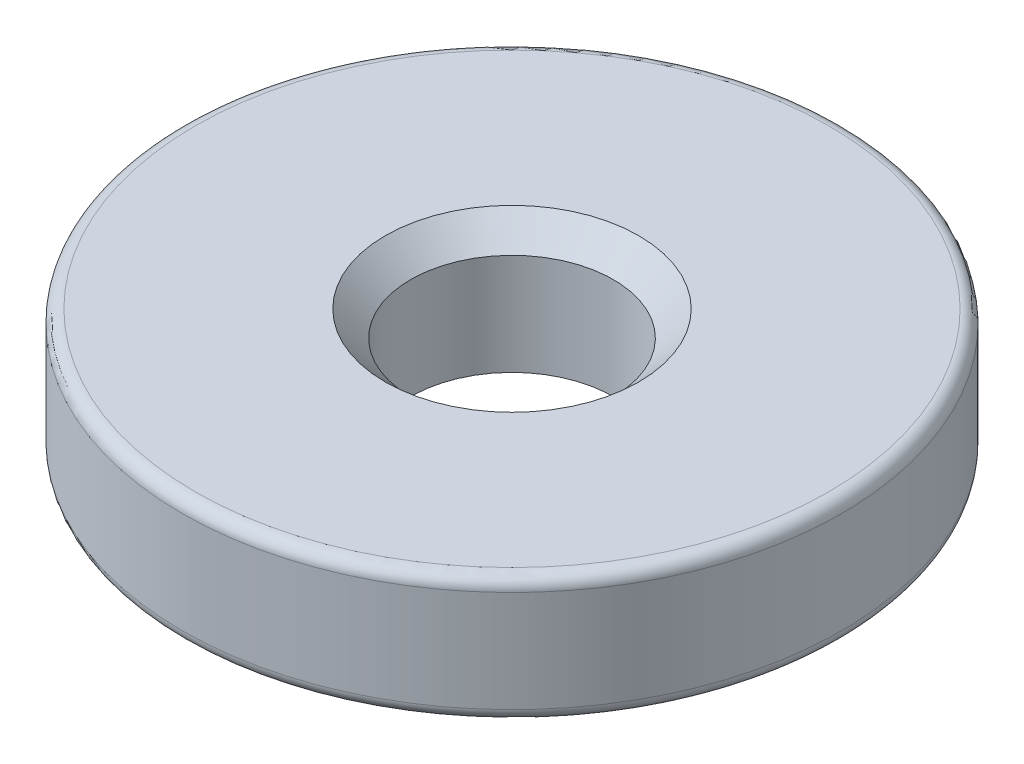
ISO-10303-21;
HEADER;
FILE_DESCRIPTION(('STEP AP214'),'2;1');
FILE_NAME('part.step','',(''),(''),'','','');
FILE_SCHEMA(('AUTOMOTIVE_DESIGN { 1 0 10303 214 1 1 1 1 }'));
ENDSEC;
DATA;
#1=APPLICATION_CONTEXT('core data for automotive mechanical design processes');
#2=APPLICATION_PROTOCOL_DEFINITION('international standard','automotive_design',2000,#1);
#3=PRODUCT_CONTEXT('',#1,'mechanical');
#4=PRODUCT('Part','Part','',(#3));
#5=PRODUCT_RELATED_PRODUCT_CATEGORY('part','',(#4));
#6=PRODUCT_DEFINITION_FORMATION('','',#4);
#7=PRODUCT_DEFINITION_CONTEXT('part definition',#1,'design');
#8=PRODUCT_DEFINITION('design','',#6,#7);
#9=PRODUCT_DEFINITION_SHAPE('','',#8);
#10=(LENGTH_UNIT() NAMED_UNIT(*) SI_UNIT(.MILLI.,.METRE.));
#11=(NAMED_UNIT(*) PLANE_ANGLE_UNIT() SI_UNIT($,.RADIAN.));
#12=(NAMED_UNIT(*) SI_UNIT($,.STERADIAN.) SOLID_ANGLE_UNIT());
#13=UNCERTAINTY_MEASURE_WITH_UNIT(LENGTH_MEASURE(1.E-05),#10,'distance_accuracy_value','');
#14=(GEOMETRIC_REPRESENTATION_CONTEXT(3) GLOBAL_UNCERTAINTY_ASSIGNED_CONTEXT((#13)) GLOBAL_UNIT_ASSIGNED_CONTEXT((#10,
#11,#12)) REPRESENTATION_CONTEXT('',''));
#15=CARTESIAN_POINT('',(0.,0.,0.));
#16=DIRECTION('',(0.,0.,1.));
#17=DIRECTION('',(1.,0.,0.));
#18=AXIS2_PLACEMENT_3D('',#15,#16,#17);
#19=CARTESIAN_POINT('',(0.,5.,0.));
#20=DIRECTION('',(0.,1.,0.));
#21=DIRECTION('',(0.,0.,1.));
#22=AXIS2_PLACEMENT_3D('',#19,#20,#21);
#23=PLANE('',#22);
#24=CARTESIAN_POINT('',(0.,5.,0.));
#25=DIRECTION('',(0.,1.,0.));
#26=DIRECTION('',(0.,0.,1.));
#27=AXIS2_PLACEMENT_3D('',#24,#25,#26);
#28=CIRCLE('',#27,12.5);
#29=CARTESIAN_POINT('',(0.,5.,12.5));
#30=VERTEX_POINT('',#29);
#31=EDGE_CURVE('E10',#30,#30,#28,.T.);
#32=ORIENTED_EDGE('',*,*,#31,.T.);
#33=EDGE_LOOP('',(#32));
#34=FACE_BOUND('',#33,.T.);
#35=CARTESIAN_POINT('',(0.,5.,0.));
#36=DIRECTION('',(0.,1.,0.));
#37=DIRECTION('',(0.,0.,1.));
#38=AXIS2_PLACEMENT_3D('',#35,#36,#37);
#39=CIRCLE('',#38,5.);
#40=CARTESIAN_POINT('',(0.,5.,5.));
#41=VERTEX_POINT('',#40);
#42=EDGE_CURVE('E63',#41,#41,#39,.F.);
#43=ORIENTED_EDGE('',*,*,#42,.T.);
#44=EDGE_LOOP('',(#43));
#45=FACE_BOUND('',#44,.T.);
#46=ADVANCED_FACE('F39',(#34,#45),#23,.T.);
#47=CARTESIAN_POINT('',(0.,0.,0.));
#48=DIRECTION('',(0.,1.,0.));
#49=DIRECTION('',(0.,0.,1.));
#50=AXIS2_PLACEMENT_3D('',#47,#48,#49);
#51=PLANE('',#50);
#52=CARTESIAN_POINT('',(0.,0.,0.));
#53=DIRECTION('',(0.,1.,0.));
#54=DIRECTION('',(0.,0.,1.));
#55=AXIS2_PLACEMENT_3D('',#52,#53,#54);
#56=CIRCLE('',#55,12.5);
#57=CARTESIAN_POINT('',(0.,0.,12.5));
#58=VERTEX_POINT('',#57);
#59=EDGE_CURVE('E47',#58,#58,#56,.F.);
#60=ORIENTED_EDGE('',*,*,#59,.T.);
#61=EDGE_LOOP('',(#60));
#62=FACE_BOUND('',#61,.T.);
#63=CARTESIAN_POINT('',(0.,0.,0.));
#64=DIRECTION('',(0.,1.,0.));
#65=DIRECTION('',(0.,0.,1.));
#66=AXIS2_PLACEMENT_3D('',#63,#64,#65);
#67=CIRCLE('',#66,4.);
#68=CARTESIAN_POINT('',(0.,0.,4.));
#69=VERTEX_POINT('',#68);
#70=EDGE_CURVE('E71',#69,#69,#67,.T.);
#71=ORIENTED_EDGE('',*,*,#70,.T.);
#72=EDGE_LOOP('',(#71));
#73=FACE_BOUND('',#72,.T.);
#74=ADVANCED_FACE('F76',(#62,#73),#51,.F.);
#75=CARTESIAN_POINT('',(0.,5.,0.));
#76=DIRECTION('',(0.,-1.,0.));
#77=DIRECTION('',(0.,0.,-1.));
#78=AXIS2_PLACEMENT_3D('',#75,#76,#77);
#79=CYLINDRICAL_SURFACE('',#78,13.);
#80=CARTESIAN_POINT('',(0.,0.5,0.));
#81=DIRECTION('',(0.,1.,0.));
#82=DIRECTION('',(0.,0.,1.));
#83=AXIS2_PLACEMENT_3D('',#80,#81,#82);
#84=CIRCLE('',#83,13.);
#85=CARTESIAN_POINT('',(0.,0.5,13.));
#86=VERTEX_POINT('',#85);
#87=EDGE_CURVE('E52',#86,#86,#84,.T.);
#88=ORIENTED_EDGE('',*,*,#87,.T.);
#89=EDGE_LOOP('',(#88));
#90=FACE_BOUND('',#89,.T.);
#91=CARTESIAN_POINT('',(0.,4.5,0.));
#92=DIRECTION('',(0.,1.,0.));
#93=DIRECTION('',(0.,0.,1.));
#94=AXIS2_PLACEMENT_3D('',#91,#92,#93);
#95=CIRCLE('',#94,13.);
#96=CARTESIAN_POINT('',(0.,4.5,13.));
#97=VERTEX_POINT('',#96);
#98=EDGE_CURVE('E57',#97,#97,#95,.F.);
#99=ORIENTED_EDGE('',*,*,#98,.T.);
#100=EDGE_LOOP('',(#99));
#101=FACE_BOUND('',#100,.T.);
#102=ADVANCED_FACE('F81',(#90,#101),#79,.T.);
#103=CARTESIAN_POINT('',(0.,5.,0.));
#104=DIRECTION('',(0.,-1.,0.));
#105=DIRECTION('',(0.,0.,-1.));
#106=AXIS2_PLACEMENT_3D('',#103,#104,#105);
#107=CYLINDRICAL_SURFACE('',#106,4.);
#108=CARTESIAN_POINT('',(0.,4.,0.));
#109=DIRECTION('',(0.,1.,0.));
#110=DIRECTION('',(0.,0.,1.));
#111=AXIS2_PLACEMENT_3D('',#108,#109,#110);
#112=CIRCLE('',#111,4.);
#113=CARTESIAN_POINT('',(0.,4.,4.));
#114=VERTEX_POINT('',#113);
#115=EDGE_CURVE('E67',#114,#114,#112,.T.);
#116=ORIENTED_EDGE('',*,*,#115,.T.);
#117=EDGE_LOOP('',(#116));
#118=FACE_BOUND('',#117,.T.);
#119=ORIENTED_EDGE('',*,*,#70,.F.);
#120=EDGE_LOOP('',(#119));
#121=FACE_BOUND('',#120,.T.);
#122=ADVANCED_FACE('F78',(#118,#121),#107,.F.);
#123=CARTESIAN_POINT('',(0.,4.,0.));
#124=DIRECTION('',(0.,1.,0.));
#125=DIRECTION('',(0.,0.,1.));
#126=AXIS2_PLACEMENT_3D('',#123,#124,#125);
#127=CONICAL_SURFACE('',#126,4.,0.78539816339745);
#128=ORIENTED_EDGE('',*,*,#42,.F.);
#129=EDGE_LOOP('',(#128));
#130=FACE_BOUND('',#129,.T.);
#131=ORIENTED_EDGE('',*,*,#115,.F.);
#132=EDGE_LOOP('',(#131));
#133=FACE_BOUND('',#132,.T.);
#134=ADVANCED_FACE('F80',(#130,#133),#127,.F.);
#135=CARTESIAN_POINT('',(0.,0.5,0.));
#136=DIRECTION('',(0.,1.,0.));
#137=DIRECTION('',(0.,0.,1.));
#138=AXIS2_PLACEMENT_3D('',#135,#136,#137);
#139=TOROIDAL_SURFACE('',#138,12.5,0.5);
#140=ORIENTED_EDGE('',*,*,#59,.F.);
#141=EDGE_LOOP('',(#140));
#142=FACE_BOUND('',#141,.T.);
#143=ORIENTED_EDGE('',*,*,#87,.F.);
#144=EDGE_LOOP('',(#143));
#145=FACE_BOUND('',#144,.T.);
#146=ADVANCED_FACE('F88',(#142,#145),#139,.T.);
#147=CARTESIAN_POINT('',(0.,4.5,0.));
#148=DIRECTION('',(0.,1.,0.));
#149=DIRECTION('',(0.,0.,1.));
#150=AXIS2_PLACEMENT_3D('',#147,#148,#149);
#151=TOROIDAL_SURFACE('',#150,12.5,0.5);
#152=ORIENTED_EDGE('',*,*,#98,.F.);
#153=EDGE_LOOP('',(#152));
#154=FACE_BOUND('',#153,.T.);
#155=ORIENTED_EDGE('',*,*,#31,.F.);
#156=EDGE_LOOP('',(#155));
#157=FACE_BOUND('',#156,.T.);
#158=ADVANCED_FACE('F41',(#154,#157),#151,.T.);
#159=CLOSED_SHELL('',(#46,#74,#102,#122,#134,#146,#158));
#160=MANIFOLD_SOLID_BREP('B2',#159);
#161=ADVANCED_BREP_SHAPE_REPRESENTATION('',(#18,#160),#14);
#162=SHAPE_DEFINITION_REPRESENTATION(#9,#161);
ENDSEC;
END-ISO-10303-21;
